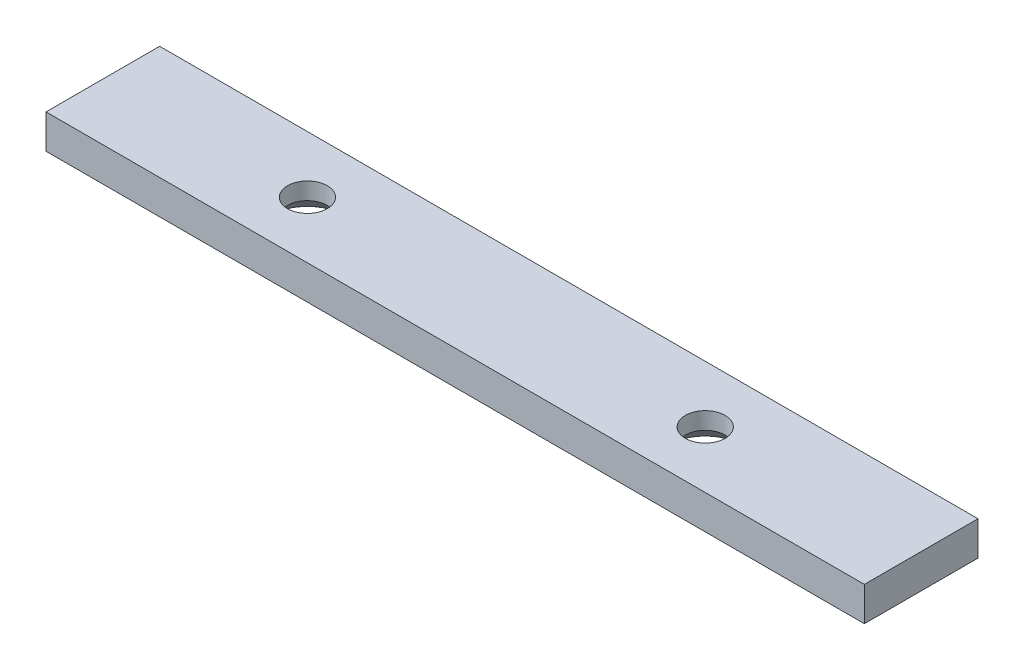
ISO-10303-21;
HEADER;
FILE_DESCRIPTION(('STEP AP214'),'2;1');
FILE_NAME('part.step','',(''),(''),'','','');
FILE_SCHEMA(('AUTOMOTIVE_DESIGN { 1 0 10303 214 1 1 1 1 }'));
ENDSEC;
DATA;
#1=APPLICATION_CONTEXT('core data for automotive mechanical design processes');
#2=APPLICATION_PROTOCOL_DEFINITION('international standard','automotive_design',2000,#1);
#3=PRODUCT_CONTEXT('',#1,'mechanical');
#4=PRODUCT('Part','Part','',(#3));
#5=PRODUCT_RELATED_PRODUCT_CATEGORY('part','',(#4));
#6=PRODUCT_DEFINITION_FORMATION('','',#4);
#7=PRODUCT_DEFINITION_CONTEXT('part definition',#1,'design');
#8=PRODUCT_DEFINITION('design','',#6,#7);
#9=PRODUCT_DEFINITION_SHAPE('','',#8);
#10=(LENGTH_UNIT() NAMED_UNIT(*) SI_UNIT(.MILLI.,.METRE.));
#11=(NAMED_UNIT(*) PLANE_ANGLE_UNIT() SI_UNIT($,.RADIAN.));
#12=(NAMED_UNIT(*) SI_UNIT($,.STERADIAN.) SOLID_ANGLE_UNIT());
#13=UNCERTAINTY_MEASURE_WITH_UNIT(LENGTH_MEASURE(1.E-05),#10,'distance_accuracy_value','');
#14=(GEOMETRIC_REPRESENTATION_CONTEXT(3) GLOBAL_UNCERTAINTY_ASSIGNED_CONTEXT((#13)) GLOBAL_UNIT_ASSIGNED_CONTEXT((#10,
#11,#12)) REPRESENTATION_CONTEXT('',''));
#15=CARTESIAN_POINT('',(0.,0.,0.));
#16=DIRECTION('',(0.,0.,1.));
#17=DIRECTION('',(1.,0.,0.));
#18=AXIS2_PLACEMENT_3D('',#15,#16,#17);
#19=CARTESIAN_POINT('',(72.,6.,-10.));
#20=DIRECTION('',(-1.,0.,0.));
#21=DIRECTION('',(0.,0.,1.));
#22=AXIS2_PLACEMENT_3D('',#19,#20,#21);
#23=PLANE('',#22);
#24=DIRECTION('',(0.,0.,-1.));
#25=VECTOR('',#24,1.);
#26=CARTESIAN_POINT('',(72.,0.,-10.));
#27=LINE('',#26,#25);
#28=CARTESIAN_POINT('',(72.,0.,10.));
#29=VERTEX_POINT('',#28);
#30=CARTESIAN_POINT('',(72.,0.,-10.));
#31=VERTEX_POINT('',#30);
#32=EDGE_CURVE('E111',#29,#31,#27,.T.);
#33=ORIENTED_EDGE('',*,*,#32,.T.);
#34=DIRECTION('',(0.,-1.,0.));
#35=VECTOR('',#34,1.);
#36=CARTESIAN_POINT('',(72.,6.,-10.));
#37=LINE('',#36,#35);
#38=CARTESIAN_POINT('',(72.,6.,-10.));
#39=VERTEX_POINT('',#38);
#40=EDGE_CURVE('E11',#39,#31,#37,.T.);
#41=ORIENTED_EDGE('',*,*,#40,.F.);
#42=DIRECTION('',(0.,0.,-1.));
#43=VECTOR('',#42,1.);
#44=CARTESIAN_POINT('',(72.,6.,-10.));
#45=LINE('',#44,#43);
#46=CARTESIAN_POINT('',(72.,6.,10.));
#47=VERTEX_POINT('',#46);
#48=EDGE_CURVE('E95',#47,#39,#45,.T.);
#49=ORIENTED_EDGE('',*,*,#48,.F.);
#50=DIRECTION('',(0.,-1.,0.));
#51=VECTOR('',#50,1.);
#52=CARTESIAN_POINT('',(72.,6.,10.));
#53=LINE('',#52,#51);
#54=EDGE_CURVE('E107',#47,#29,#53,.T.);
#55=ORIENTED_EDGE('',*,*,#54,.T.);
#56=EDGE_LOOP('',(#33,#41,#49,#55));
#57=FACE_BOUND('',#56,.T.);
#58=ADVANCED_FACE('F43',(#57),#23,.F.);
#59=CARTESIAN_POINT('',(-72.,6.,-10.));
#60=DIRECTION('',(0.,0.,1.));
#61=DIRECTION('',(1.,0.,0.));
#62=AXIS2_PLACEMENT_3D('',#59,#60,#61);
#63=PLANE('',#62);
#64=DIRECTION('',(-1.,0.,0.));
#65=VECTOR('',#64,1.);
#66=CARTESIAN_POINT('',(-72.,0.,-10.));
#67=LINE('',#66,#65);
#68=CARTESIAN_POINT('',(-72.,0.,-10.));
#69=VERTEX_POINT('',#68);
#70=EDGE_CURVE('E100',#31,#69,#67,.T.);
#71=ORIENTED_EDGE('',*,*,#70,.T.);
#72=DIRECTION('',(0.,-1.,0.));
#73=VECTOR('',#72,1.);
#74=CARTESIAN_POINT('',(-72.,6.,-10.));
#75=LINE('',#74,#73);
#76=CARTESIAN_POINT('',(-72.,6.,-10.));
#77=VERTEX_POINT('',#76);
#78=EDGE_CURVE('E52',#77,#69,#75,.T.);
#79=ORIENTED_EDGE('',*,*,#78,.F.);
#80=DIRECTION('',(-1.,0.,0.));
#81=VECTOR('',#80,1.);
#82=CARTESIAN_POINT('',(-72.,6.,-10.));
#83=LINE('',#82,#81);
#84=EDGE_CURVE('E90',#39,#77,#83,.T.);
#85=ORIENTED_EDGE('',*,*,#84,.F.);
#86=ORIENTED_EDGE('',*,*,#40,.T.);
#87=EDGE_LOOP('',(#71,#79,#85,#86));
#88=FACE_BOUND('',#87,.T.);
#89=ADVANCED_FACE('F99',(#88),#63,.F.);
#90=CARTESIAN_POINT('',(-72.,6.,-10.));
#91=DIRECTION('',(1.,0.,0.));
#92=DIRECTION('',(0.,0.,-1.));
#93=AXIS2_PLACEMENT_3D('',#90,#91,#92);
#94=PLANE('',#93);
#95=DIRECTION('',(0.,0.,1.));
#96=VECTOR('',#95,1.);
#97=CARTESIAN_POINT('',(-72.,0.,-10.));
#98=LINE('',#97,#96);
#99=CARTESIAN_POINT('',(-72.,0.,10.));
#100=VERTEX_POINT('',#99);
#101=EDGE_CURVE('E77',#69,#100,#98,.T.);
#102=ORIENTED_EDGE('',*,*,#101,.T.);
#103=DIRECTION('',(0.,-1.,0.));
#104=VECTOR('',#103,1.);
#105=CARTESIAN_POINT('',(-72.,6.,10.));
#106=LINE('',#105,#104);
#107=CARTESIAN_POINT('',(-72.,6.,10.));
#108=VERTEX_POINT('',#107);
#109=EDGE_CURVE('E102',#108,#100,#106,.T.);
#110=ORIENTED_EDGE('',*,*,#109,.F.);
#111=DIRECTION('',(0.,0.,1.));
#112=VECTOR('',#111,1.);
#113=CARTESIAN_POINT('',(-72.,6.,-10.));
#114=LINE('',#113,#112);
#115=EDGE_CURVE('E93',#77,#108,#114,.T.);
#116=ORIENTED_EDGE('',*,*,#115,.F.);
#117=ORIENTED_EDGE('',*,*,#78,.T.);
#118=EDGE_LOOP('',(#102,#110,#116,#117));
#119=FACE_BOUND('',#118,.T.);
#120=ADVANCED_FACE('F103',(#119),#94,.F.);
#121=CARTESIAN_POINT('',(-72.,6.,10.));
#122=DIRECTION('',(0.,0.,-1.));
#123=DIRECTION('',(-1.,0.,0.));
#124=AXIS2_PLACEMENT_3D('',#121,#122,#123);
#125=PLANE('',#124);
#126=DIRECTION('',(1.,0.,0.));
#127=VECTOR('',#126,1.);
#128=CARTESIAN_POINT('',(-72.,0.,10.));
#129=LINE('',#128,#127);
#130=EDGE_CURVE('E83',#100,#29,#129,.T.);
#131=ORIENTED_EDGE('',*,*,#130,.T.);
#132=ORIENTED_EDGE('',*,*,#54,.F.);
#133=DIRECTION('',(1.,0.,0.));
#134=VECTOR('',#133,1.);
#135=CARTESIAN_POINT('',(-72.,6.,10.));
#136=LINE('',#135,#134);
#137=EDGE_CURVE('E60',#108,#47,#136,.T.);
#138=ORIENTED_EDGE('',*,*,#137,.F.);
#139=ORIENTED_EDGE('',*,*,#109,.T.);
#140=EDGE_LOOP('',(#131,#132,#138,#139));
#141=FACE_BOUND('',#140,.T.);
#142=ADVANCED_FACE('F125',(#141),#125,.F.);
#143=CARTESIAN_POINT('',(0.,6.,0.));
#144=DIRECTION('',(0.,1.,0.));
#145=DIRECTION('',(0.,0.,1.));
#146=AXIS2_PLACEMENT_3D('',#143,#144,#145);
#147=PLANE('',#146);
#148=CARTESIAN_POINT('',(-36.,6.,0.));
#149=DIRECTION('',(0.,1.,0.));
#150=DIRECTION('',(0.,0.,1.));
#151=AXIS2_PLACEMENT_3D('',#148,#149,#150);
#152=CIRCLE('',#151,3.5);
#153=CARTESIAN_POINT('',(-36.,6.,3.5));
#154=VERTEX_POINT('',#153);
#155=EDGE_CURVE('E143',#154,#154,#152,.T.);
#156=ORIENTED_EDGE('',*,*,#155,.F.);
#157=EDGE_LOOP('',(#156));
#158=FACE_BOUND('',#157,.T.);
#159=CARTESIAN_POINT('',(34.,6.,0.));
#160=DIRECTION('',(0.,1.,0.));
#161=DIRECTION('',(0.,0.,1.));
#162=AXIS2_PLACEMENT_3D('',#159,#160,#161);
#163=CIRCLE('',#162,3.5);
#164=CARTESIAN_POINT('',(34.,6.,3.5));
#165=VERTEX_POINT('',#164);
#166=EDGE_CURVE('E115',#165,#165,#163,.T.);
#167=ORIENTED_EDGE('',*,*,#166,.F.);
#168=EDGE_LOOP('',(#167));
#169=FACE_BOUND('',#168,.T.);
#170=ORIENTED_EDGE('',*,*,#48,.T.);
#171=ORIENTED_EDGE('',*,*,#84,.T.);
#172=ORIENTED_EDGE('',*,*,#115,.T.);
#173=ORIENTED_EDGE('',*,*,#137,.T.);
#174=EDGE_LOOP('',(#170,#171,#172,#173));
#175=FACE_BOUND('',#174,.T.);
#176=ADVANCED_FACE('F91',(#158,#169,#175),#147,.T.);
#177=CARTESIAN_POINT('',(0.,0.,0.));
#178=DIRECTION('',(0.,1.,0.));
#179=DIRECTION('',(0.,0.,1.));
#180=AXIS2_PLACEMENT_3D('',#177,#178,#179);
#181=PLANE('',#180);
#182=CARTESIAN_POINT('',(-36.,0.,0.));
#183=DIRECTION('',(0.,-1.,0.));
#184=DIRECTION('',(0.,0.,-1.));
#185=AXIS2_PLACEMENT_3D('',#182,#183,#184);
#186=CIRCLE('',#185,6.5);
#187=CARTESIAN_POINT('',(-36.,0.,-6.5));
#188=VERTEX_POINT('',#187);
#189=EDGE_CURVE('E151',#188,#188,#186,.T.);
#190=ORIENTED_EDGE('',*,*,#189,.F.);
#191=EDGE_LOOP('',(#190));
#192=FACE_BOUND('',#191,.T.);
#193=CARTESIAN_POINT('',(34.,0.,0.));
#194=DIRECTION('',(0.,-1.,0.));
#195=DIRECTION('',(0.,0.,-1.));
#196=AXIS2_PLACEMENT_3D('',#193,#194,#195);
#197=CIRCLE('',#196,6.5);
#198=CARTESIAN_POINT('',(34.,0.,-6.5));
#199=VERTEX_POINT('',#198);
#200=EDGE_CURVE('E139',#199,#199,#197,.T.);
#201=ORIENTED_EDGE('',*,*,#200,.F.);
#202=EDGE_LOOP('',(#201));
#203=FACE_BOUND('',#202,.T.);
#204=ORIENTED_EDGE('',*,*,#32,.F.);
#205=ORIENTED_EDGE('',*,*,#130,.F.);
#206=ORIENTED_EDGE('',*,*,#101,.F.);
#207=ORIENTED_EDGE('',*,*,#70,.F.);
#208=EDGE_LOOP('',(#204,#205,#206,#207));
#209=FACE_BOUND('',#208,.T.);
#210=ADVANCED_FACE('F128',(#192,#203,#209),#181,.F.);
#211=CARTESIAN_POINT('',(34.,0.,0.));
#212=DIRECTION('',(0.,-1.,0.));
#213=DIRECTION('',(0.,0.,-1.));
#214=AXIS2_PLACEMENT_3D('',#211,#212,#213);
#215=CYLINDRICAL_SURFACE('',#214,3.5);
#216=CARTESIAN_POINT('',(34.,3.,0.));
#217=DIRECTION('',(0.,-1.,0.));
#218=DIRECTION('',(0.,0.,-1.));
#219=AXIS2_PLACEMENT_3D('',#216,#217,#218);
#220=CIRCLE('',#219,3.5);
#221=CARTESIAN_POINT('',(34.,3.,-3.5));
#222=VERTEX_POINT('',#221);
#223=EDGE_CURVE('E135',#222,#222,#220,.T.);
#224=ORIENTED_EDGE('',*,*,#223,.T.);
#225=EDGE_LOOP('',(#224));
#226=FACE_BOUND('',#225,.T.);
#227=ORIENTED_EDGE('',*,*,#166,.T.);
#228=EDGE_LOOP('',(#227));
#229=FACE_BOUND('',#228,.T.);
#230=ADVANCED_FACE('F160',(#226,#229),#215,.F.);
#231=CARTESIAN_POINT('',(34.,0.,0.));
#232=DIRECTION('',(0.,-1.,0.));
#233=DIRECTION('',(0.,0.,-1.));
#234=AXIS2_PLACEMENT_3D('',#231,#232,#233);
#235=CONICAL_SURFACE('',#234,6.5,0.785398163397448);
#236=ORIENTED_EDGE('',*,*,#223,.F.);
#237=EDGE_LOOP('',(#236));
#238=FACE_BOUND('',#237,.T.);
#239=ORIENTED_EDGE('',*,*,#200,.T.);
#240=EDGE_LOOP('',(#239));
#241=FACE_BOUND('',#240,.T.);
#242=ADVANCED_FACE('F164',(#238,#241),#235,.F.);
#243=CARTESIAN_POINT('',(-36.,0.,0.));
#244=DIRECTION('',(0.,-1.,0.));
#245=DIRECTION('',(0.,0.,-1.));
#246=AXIS2_PLACEMENT_3D('',#243,#244,#245);
#247=CYLINDRICAL_SURFACE('',#246,3.5);
#248=CARTESIAN_POINT('',(-36.,3.,0.));
#249=DIRECTION('',(0.,-1.,0.));
#250=DIRECTION('',(0.,0.,-1.));
#251=AXIS2_PLACEMENT_3D('',#248,#249,#250);
#252=CIRCLE('',#251,3.5);
#253=CARTESIAN_POINT('',(-36.,3.,-3.5));
#254=VERTEX_POINT('',#253);
#255=EDGE_CURVE('E147',#254,#254,#252,.T.);
#256=ORIENTED_EDGE('',*,*,#255,.T.);
#257=EDGE_LOOP('',(#256));
#258=FACE_BOUND('',#257,.T.);
#259=ORIENTED_EDGE('',*,*,#155,.T.);
#260=EDGE_LOOP('',(#259));
#261=FACE_BOUND('',#260,.T.);
#262=ADVANCED_FACE('F166',(#258,#261),#247,.F.);
#263=CARTESIAN_POINT('',(-36.,0.,0.));
#264=DIRECTION('',(0.,-1.,0.));
#265=DIRECTION('',(0.,0.,-1.));
#266=AXIS2_PLACEMENT_3D('',#263,#264,#265);
#267=CONICAL_SURFACE('',#266,6.5,0.785398163397448);
#268=ORIENTED_EDGE('',*,*,#255,.F.);
#269=EDGE_LOOP('',(#268));
#270=FACE_BOUND('',#269,.T.);
#271=ORIENTED_EDGE('',*,*,#189,.T.);
#272=EDGE_LOOP('',(#271));
#273=FACE_BOUND('',#272,.T.);
#274=ADVANCED_FACE('F156',(#270,#273),#267,.F.);
#275=CLOSED_SHELL('',(#58,#89,#120,#142,#176,#210,#230,#242,#262,#274));
#276=MANIFOLD_SOLID_BREP('B2',#275);
#277=ADVANCED_BREP_SHAPE_REPRESENTATION('',(#18,#276),#14);
#278=SHAPE_DEFINITION_REPRESENTATION(#9,#277);
ENDSEC;
END-ISO-10303-21;
